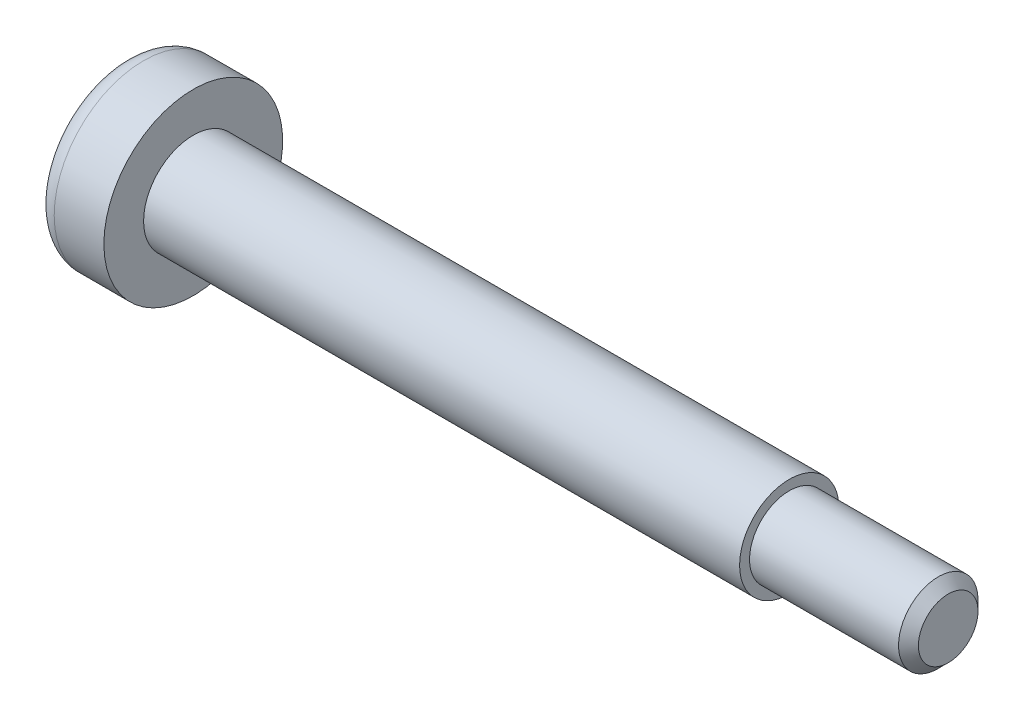
ISO-10303-21;
HEADER;
FILE_DESCRIPTION(('STEP AP214'),'2;1');
FILE_NAME('part.step','',(''),(''),'','','');
FILE_SCHEMA(('AUTOMOTIVE_DESIGN { 1 0 10303 214 1 1 1 1 }'));
ENDSEC;
DATA;
#1=APPLICATION_CONTEXT('core data for automotive mechanical design processes');
#2=APPLICATION_PROTOCOL_DEFINITION('international standard','automotive_design',2000,#1);
#3=PRODUCT_CONTEXT('',#1,'mechanical');
#4=PRODUCT('Part','Part','',(#3));
#5=PRODUCT_RELATED_PRODUCT_CATEGORY('part','',(#4));
#6=PRODUCT_DEFINITION_FORMATION('','',#4);
#7=PRODUCT_DEFINITION_CONTEXT('part definition',#1,'design');
#8=PRODUCT_DEFINITION('design','',#6,#7);
#9=PRODUCT_DEFINITION_SHAPE('','',#8);
#10=(LENGTH_UNIT() NAMED_UNIT(*) SI_UNIT(.MILLI.,.METRE.));
#11=(NAMED_UNIT(*) PLANE_ANGLE_UNIT() SI_UNIT($,.RADIAN.));
#12=(NAMED_UNIT(*) SI_UNIT($,.STERADIAN.) SOLID_ANGLE_UNIT());
#13=UNCERTAINTY_MEASURE_WITH_UNIT(LENGTH_MEASURE(1.E-05),#10,'distance_accuracy_value','');
#14=(GEOMETRIC_REPRESENTATION_CONTEXT(3) GLOBAL_UNCERTAINTY_ASSIGNED_CONTEXT((#13)) GLOBAL_UNIT_ASSIGNED_CONTEXT((#10,
#11,#12)) REPRESENTATION_CONTEXT('',''));
#15=CARTESIAN_POINT('',(0.,0.,0.));
#16=DIRECTION('',(0.,0.,1.));
#17=DIRECTION('',(1.,0.,0.));
#18=AXIS2_PLACEMENT_3D('',#15,#16,#17);
#19=CARTESIAN_POINT('',(0.,0.,0.));
#20=DIRECTION('',(1.,0.,0.));
#21=DIRECTION('',(0.,0.,-1.));
#22=AXIS2_PLACEMENT_3D('',#19,#20,#21);
#23=PLANE('',#22);
#24=CARTESIAN_POINT('',(0.,0.,0.));
#25=DIRECTION('',(1.,0.,0.));
#26=DIRECTION('',(0.,0.,-1.));
#27=AXIS2_PLACEMENT_3D('',#24,#25,#26);
#28=CIRCLE('',#27,3.5);
#29=CARTESIAN_POINT('',(0.,0.,-3.5));
#30=VERTEX_POINT('',#29);
#31=EDGE_CURVE('E156',#30,#30,#28,.F.);
#32=ORIENTED_EDGE('',*,*,#31,.T.);
#33=EDGE_LOOP('',(#32));
#34=FACE_BOUND('',#33,.T.);
#35=DIRECTION('',(0.,-0.5,-0.866025403784439));
#36=VECTOR('',#35,1.);
#37=CARTESIAN_POINT('',(0.,1.73205080756888,0.));
#38=LINE('',#37,#36);
#39=CARTESIAN_POINT('',(0.,1.73205080756888,0.));
#40=VERTEX_POINT('',#39);
#41=CARTESIAN_POINT('',(0.,0.866025403784439,-1.5));
#42=VERTEX_POINT('',#41);
#43=EDGE_CURVE('E126',#40,#42,#38,.T.);
#44=ORIENTED_EDGE('',*,*,#43,.F.);
#45=DIRECTION('',(0.,0.5,-0.866025403784439));
#46=VECTOR('',#45,1.);
#47=CARTESIAN_POINT('',(0.,0.86602540378444,1.5));
#48=LINE('',#47,#46);
#49=CARTESIAN_POINT('',(0.,0.86602540378444,1.5));
#50=VERTEX_POINT('',#49);
#51=EDGE_CURVE('E52',#50,#40,#48,.T.);
#52=ORIENTED_EDGE('',*,*,#51,.F.);
#53=DIRECTION('',(0.,1.,0.));
#54=VECTOR('',#53,1.);
#55=CARTESIAN_POINT('',(0.,-0.866025403784439,1.5));
#56=LINE('',#55,#54);
#57=CARTESIAN_POINT('',(0.,-0.866025403784439,1.5));
#58=VERTEX_POINT('',#57);
#59=EDGE_CURVE('E135',#58,#50,#56,.T.);
#60=ORIENTED_EDGE('',*,*,#59,.F.);
#61=DIRECTION('',(0.,0.5,0.866025403784439));
#62=VECTOR('',#61,1.);
#63=CARTESIAN_POINT('',(0.,-1.73205080756888,0.));
#64=LINE('',#63,#62);
#65=CARTESIAN_POINT('',(0.,-1.73205080756888,0.));
#66=VERTEX_POINT('',#65);
#67=EDGE_CURVE('E133',#66,#58,#64,.T.);
#68=ORIENTED_EDGE('',*,*,#67,.F.);
#69=DIRECTION('',(0.,-0.5,0.866025403784439));
#70=VECTOR('',#69,1.);
#71=CARTESIAN_POINT('',(0.,-0.866025403784439,-1.5));
#72=LINE('',#71,#70);
#73=CARTESIAN_POINT('',(0.,-0.866025403784439,-1.5));
#74=VERTEX_POINT('',#73);
#75=EDGE_CURVE('E100',#74,#66,#72,.T.);
#76=ORIENTED_EDGE('',*,*,#75,.F.);
#77=DIRECTION('',(0.,-1.,0.));
#78=VECTOR('',#77,1.);
#79=CARTESIAN_POINT('',(0.,0.866025403784439,-1.5));
#80=LINE('',#79,#78);
#81=EDGE_CURVE('E129',#42,#74,#80,.T.);
#82=ORIENTED_EDGE('',*,*,#81,.F.);
#83=EDGE_LOOP('',(#44,#52,#60,#68,#76,#82));
#84=FACE_BOUND('',#83,.T.);
#85=ADVANCED_FACE('F37',(#34,#84),#23,.F.);
#86=CARTESIAN_POINT('',(0.,0.,0.));
#87=DIRECTION('',(-1.,0.,0.));
#88=DIRECTION('',(0.,0.,1.));
#89=AXIS2_PLACEMENT_3D('',#86,#87,#88);
#90=CYLINDRICAL_SURFACE('',#89,4.5);
#91=CARTESIAN_POINT('',(1.,0.,0.));
#92=DIRECTION('',(1.,0.,0.));
#93=DIRECTION('',(0.,0.,-1.));
#94=AXIS2_PLACEMENT_3D('',#91,#92,#93);
#95=CIRCLE('',#94,4.5);
#96=CARTESIAN_POINT('',(1.,0.,-4.5));
#97=VERTEX_POINT('',#96);
#98=EDGE_CURVE('E159',#97,#97,#95,.T.);
#99=ORIENTED_EDGE('',*,*,#98,.T.);
#100=EDGE_LOOP('',(#99));
#101=FACE_BOUND('',#100,.T.);
#102=CARTESIAN_POINT('',(3.5,0.,0.));
#103=DIRECTION('',(-1.,0.,0.));
#104=DIRECTION('',(0.,0.,1.));
#105=AXIS2_PLACEMENT_3D('',#102,#103,#104);
#106=CIRCLE('',#105,4.5);
#107=CARTESIAN_POINT('',(3.5,0.,4.5));
#108=VERTEX_POINT('',#107);
#109=EDGE_CURVE('E153',#108,#108,#106,.T.);
#110=ORIENTED_EDGE('',*,*,#109,.T.);
#111=EDGE_LOOP('',(#110));
#112=FACE_BOUND('',#111,.T.);
#113=ADVANCED_FACE('F176',(#101,#112),#90,.T.);
#114=CARTESIAN_POINT('',(3.5,4.5,0.));
#115=DIRECTION('',(-1.,0.,0.));
#116=DIRECTION('',(0.,0.,1.));
#117=AXIS2_PLACEMENT_3D('',#114,#115,#116);
#118=PLANE('',#117);
#119=ORIENTED_EDGE('',*,*,#109,.F.);
#120=EDGE_LOOP('',(#119));
#121=FACE_BOUND('',#120,.T.);
#122=CARTESIAN_POINT('',(3.5,0.,0.));
#123=DIRECTION('',(-1.,0.,0.));
#124=DIRECTION('',(0.,0.,1.));
#125=AXIS2_PLACEMENT_3D('',#122,#123,#124);
#126=CIRCLE('',#125,2.5);
#127=CARTESIAN_POINT('',(3.5,0.,2.5));
#128=VERTEX_POINT('',#127);
#129=EDGE_CURVE('E150',#128,#128,#126,.T.);
#130=ORIENTED_EDGE('',*,*,#129,.T.);
#131=EDGE_LOOP('',(#130));
#132=FACE_BOUND('',#131,.T.);
#133=ADVANCED_FACE('F182',(#121,#132),#118,.F.);
#134=CARTESIAN_POINT('',(0.,0.,0.));
#135=DIRECTION('',(-1.,0.,0.));
#136=DIRECTION('',(0.,0.,1.));
#137=AXIS2_PLACEMENT_3D('',#134,#135,#136);
#138=CYLINDRICAL_SURFACE('',#137,2.5);
#139=ORIENTED_EDGE('',*,*,#129,.F.);
#140=EDGE_LOOP('',(#139));
#141=FACE_BOUND('',#140,.T.);
#142=CARTESIAN_POINT('',(33.5,0.,0.));
#143=DIRECTION('',(-1.,0.,0.));
#144=DIRECTION('',(0.,0.,1.));
#145=AXIS2_PLACEMENT_3D('',#142,#143,#144);
#146=CIRCLE('',#145,2.5);
#147=CARTESIAN_POINT('',(33.5,0.,2.5));
#148=VERTEX_POINT('',#147);
#149=EDGE_CURVE('E147',#148,#148,#146,.T.);
#150=ORIENTED_EDGE('',*,*,#149,.T.);
#151=EDGE_LOOP('',(#150));
#152=FACE_BOUND('',#151,.T.);
#153=ADVANCED_FACE('F189',(#141,#152),#138,.T.);
#154=CARTESIAN_POINT('',(33.5,2.5,0.));
#155=DIRECTION('',(-1.,0.,0.));
#156=DIRECTION('',(0.,0.,1.));
#157=AXIS2_PLACEMENT_3D('',#154,#155,#156);
#158=PLANE('',#157);
#159=ORIENTED_EDGE('',*,*,#149,.F.);
#160=EDGE_LOOP('',(#159));
#161=FACE_BOUND('',#160,.T.);
#162=CARTESIAN_POINT('',(33.5,0.,0.));
#163=DIRECTION('',(-1.,0.,0.));
#164=DIRECTION('',(0.,0.,1.));
#165=AXIS2_PLACEMENT_3D('',#162,#163,#164);
#166=CIRCLE('',#165,2.);
#167=CARTESIAN_POINT('',(33.5,0.,2.));
#168=VERTEX_POINT('',#167);
#169=EDGE_CURVE('E139',#168,#168,#166,.T.);
#170=ORIENTED_EDGE('',*,*,#169,.T.);
#171=EDGE_LOOP('',(#170));
#172=FACE_BOUND('',#171,.T.);
#173=ADVANCED_FACE('F193',(#161,#172),#158,.F.);
#174=CARTESIAN_POINT('',(0.,0.,0.));
#175=DIRECTION('',(-1.,0.,0.));
#176=DIRECTION('',(0.,0.,1.));
#177=AXIS2_PLACEMENT_3D('',#174,#175,#176);
#178=CYLINDRICAL_SURFACE('',#177,2.);
#179=CARTESIAN_POINT('',(41.,0.,0.));
#180=DIRECTION('',(-1.,0.,0.));
#181=DIRECTION('',(0.,0.,1.));
#182=AXIS2_PLACEMENT_3D('',#179,#180,#181);
#183=CIRCLE('',#182,2.);
#184=CARTESIAN_POINT('',(41.,0.,2.));
#185=VERTEX_POINT('',#184);
#186=EDGE_CURVE('E45',#185,#185,#183,.T.);
#187=ORIENTED_EDGE('',*,*,#186,.T.);
#188=EDGE_LOOP('',(#187));
#189=FACE_BOUND('',#188,.T.);
#190=ORIENTED_EDGE('',*,*,#169,.F.);
#191=EDGE_LOOP('',(#190));
#192=FACE_BOUND('',#191,.T.);
#193=ADVANCED_FACE('F164',(#189,#192),#178,.T.);
#194=CARTESIAN_POINT('',(41.5,2.,0.));
#195=DIRECTION('',(-1.,0.,0.));
#196=DIRECTION('',(0.,0.,1.));
#197=AXIS2_PLACEMENT_3D('',#194,#195,#196);
#198=PLANE('',#197);
#199=CARTESIAN_POINT('',(41.5,0.,0.));
#200=DIRECTION('',(-1.,0.,0.));
#201=DIRECTION('',(0.,0.,1.));
#202=AXIS2_PLACEMENT_3D('',#199,#200,#201);
#203=CIRCLE('',#202,1.49999999999999);
#204=CARTESIAN_POINT('',(41.5,0.,1.49999999999999));
#205=VERTEX_POINT('',#204);
#206=EDGE_CURVE('E11',#205,#205,#203,.F.);
#207=ORIENTED_EDGE('',*,*,#206,.T.);
#208=EDGE_LOOP('',(#207));
#209=FACE_BOUND('',#208,.T.);
#210=ADVANCED_FACE('F200',(#209),#198,.F.);
#211=CARTESIAN_POINT('',(2.4,0.86602540378444,1.5));
#212=DIRECTION('',(0.,0.866025403784439,0.5));
#213=DIRECTION('',(0.,-0.5,0.866025403784439));
#214=AXIS2_PLACEMENT_3D('',#211,#212,#213);
#215=PLANE('',#214);
#216=ORIENTED_EDGE('',*,*,#51,.T.);
#217=DIRECTION('',(-1.,0.,0.));
#218=VECTOR('',#217,1.);
#219=CARTESIAN_POINT('',(2.4,1.73205080756888,0.));
#220=LINE('',#219,#218);
#221=CARTESIAN_POINT('',(2.4,1.73205080756888,0.));
#222=VERTEX_POINT('',#221);
#223=EDGE_CURVE('E82',#222,#40,#220,.T.);
#224=ORIENTED_EDGE('',*,*,#223,.F.);
#225=DIRECTION('',(0.,0.5,-0.866025403784439));
#226=VECTOR('',#225,1.);
#227=CARTESIAN_POINT('',(2.4,0.86602540378444,1.5));
#228=LINE('',#227,#226);
#229=CARTESIAN_POINT('',(2.4,0.86602540378444,1.5));
#230=VERTEX_POINT('',#229);
#231=EDGE_CURVE('E137',#230,#222,#228,.T.);
#232=ORIENTED_EDGE('',*,*,#231,.F.);
#233=DIRECTION('',(-1.,0.,0.));
#234=VECTOR('',#233,1.);
#235=CARTESIAN_POINT('',(2.4,0.86602540378444,1.5));
#236=LINE('',#235,#234);
#237=EDGE_CURVE('E60',#230,#50,#236,.T.);
#238=ORIENTED_EDGE('',*,*,#237,.T.);
#239=EDGE_LOOP('',(#216,#224,#232,#238));
#240=FACE_BOUND('',#239,.T.);
#241=ADVANCED_FACE('F203',(#240),#215,.F.);
#242=CARTESIAN_POINT('',(2.4,-0.866025403784439,1.5));
#243=DIRECTION('',(0.,0.,1.));
#244=DIRECTION('',(1.,0.,0.));
#245=AXIS2_PLACEMENT_3D('',#242,#243,#244);
#246=PLANE('',#245);
#247=ORIENTED_EDGE('',*,*,#59,.T.);
#248=ORIENTED_EDGE('',*,*,#237,.F.);
#249=DIRECTION('',(0.,1.,0.));
#250=VECTOR('',#249,1.);
#251=CARTESIAN_POINT('',(2.4,-0.866025403784439,1.5));
#252=LINE('',#251,#250);
#253=CARTESIAN_POINT('',(2.4,-0.866025403784439,1.5));
#254=VERTEX_POINT('',#253);
#255=EDGE_CURVE('E112',#254,#230,#252,.T.);
#256=ORIENTED_EDGE('',*,*,#255,.F.);
#257=DIRECTION('',(-1.,0.,0.));
#258=VECTOR('',#257,1.);
#259=CARTESIAN_POINT('',(2.4,-0.866025403784439,1.5));
#260=LINE('',#259,#258);
#261=EDGE_CURVE('E104',#254,#58,#260,.T.);
#262=ORIENTED_EDGE('',*,*,#261,.T.);
#263=EDGE_LOOP('',(#247,#248,#256,#262));
#264=FACE_BOUND('',#263,.T.);
#265=ADVANCED_FACE('F207',(#264),#246,.F.);
#266=CARTESIAN_POINT('',(2.4,-1.73205080756888,0.));
#267=DIRECTION('',(0.,-0.866025403784439,0.5));
#268=DIRECTION('',(0.,-0.5,-0.866025403784439));
#269=AXIS2_PLACEMENT_3D('',#266,#267,#268);
#270=PLANE('',#269);
#271=ORIENTED_EDGE('',*,*,#67,.T.);
#272=ORIENTED_EDGE('',*,*,#261,.F.);
#273=DIRECTION('',(0.,0.5,0.866025403784439));
#274=VECTOR('',#273,1.);
#275=CARTESIAN_POINT('',(2.4,-1.73205080756888,0.));
#276=LINE('',#275,#274);
#277=CARTESIAN_POINT('',(2.4,-1.73205080756888,0.));
#278=VERTEX_POINT('',#277);
#279=EDGE_CURVE('E108',#278,#254,#276,.T.);
#280=ORIENTED_EDGE('',*,*,#279,.F.);
#281=DIRECTION('',(-1.,0.,0.));
#282=VECTOR('',#281,1.);
#283=CARTESIAN_POINT('',(2.4,-1.73205080756888,0.));
#284=LINE('',#283,#282);
#285=EDGE_CURVE('E93',#278,#66,#284,.T.);
#286=ORIENTED_EDGE('',*,*,#285,.T.);
#287=EDGE_LOOP('',(#271,#272,#280,#286));
#288=FACE_BOUND('',#287,.T.);
#289=ADVANCED_FACE('F109',(#288),#270,.F.);
#290=CARTESIAN_POINT('',(2.4,-0.866025403784439,-1.5));
#291=DIRECTION('',(0.,-0.866025403784439,-0.5));
#292=DIRECTION('',(0.,0.5,-0.866025403784439));
#293=AXIS2_PLACEMENT_3D('',#290,#291,#292);
#294=PLANE('',#293);
#295=ORIENTED_EDGE('',*,*,#75,.T.);
#296=ORIENTED_EDGE('',*,*,#285,.F.);
#297=DIRECTION('',(0.,-0.5,0.866025403784439));
#298=VECTOR('',#297,1.);
#299=CARTESIAN_POINT('',(2.4,-0.866025403784439,-1.5));
#300=LINE('',#299,#298);
#301=CARTESIAN_POINT('',(2.4,-0.866025403784439,-1.5));
#302=VERTEX_POINT('',#301);
#303=EDGE_CURVE('E97',#302,#278,#300,.T.);
#304=ORIENTED_EDGE('',*,*,#303,.F.);
#305=DIRECTION('',(-1.,0.,0.));
#306=VECTOR('',#305,1.);
#307=CARTESIAN_POINT('',(2.4,-0.866025403784439,-1.5));
#308=LINE('',#307,#306);
#309=EDGE_CURVE('E105',#302,#74,#308,.T.);
#310=ORIENTED_EDGE('',*,*,#309,.T.);
#311=EDGE_LOOP('',(#295,#296,#304,#310));
#312=FACE_BOUND('',#311,.T.);
#313=ADVANCED_FACE('F95',(#312),#294,.F.);
#314=CARTESIAN_POINT('',(2.4,0.866025403784439,-1.5));
#315=DIRECTION('',(0.,0.,-1.));
#316=DIRECTION('',(-1.,0.,0.));
#317=AXIS2_PLACEMENT_3D('',#314,#315,#316);
#318=PLANE('',#317);
#319=ORIENTED_EDGE('',*,*,#81,.T.);
#320=ORIENTED_EDGE('',*,*,#309,.F.);
#321=DIRECTION('',(0.,-1.,0.));
#322=VECTOR('',#321,1.);
#323=CARTESIAN_POINT('',(2.4,0.866025403784439,-1.5));
#324=LINE('',#323,#322);
#325=CARTESIAN_POINT('',(2.4,0.866025403784439,-1.5));
#326=VERTEX_POINT('',#325);
#327=EDGE_CURVE('E118',#326,#302,#324,.T.);
#328=ORIENTED_EDGE('',*,*,#327,.F.);
#329=DIRECTION('',(-1.,0.,0.));
#330=VECTOR('',#329,1.);
#331=CARTESIAN_POINT('',(2.4,0.866025403784439,-1.5));
#332=LINE('',#331,#330);
#333=EDGE_CURVE('E142',#326,#42,#332,.T.);
#334=ORIENTED_EDGE('',*,*,#333,.T.);
#335=EDGE_LOOP('',(#319,#320,#328,#334));
#336=FACE_BOUND('',#335,.T.);
#337=ADVANCED_FACE('F211',(#336),#318,.F.);
#338=CARTESIAN_POINT('',(2.4,1.73205080756888,0.));
#339=DIRECTION('',(0.,0.866025403784439,-0.5));
#340=DIRECTION('',(0.,0.5,0.866025403784439));
#341=AXIS2_PLACEMENT_3D('',#338,#339,#340);
#342=PLANE('',#341);
#343=ORIENTED_EDGE('',*,*,#43,.T.);
#344=ORIENTED_EDGE('',*,*,#333,.F.);
#345=DIRECTION('',(0.,-0.5,-0.866025403784439));
#346=VECTOR('',#345,1.);
#347=CARTESIAN_POINT('',(2.4,1.73205080756888,0.));
#348=LINE('',#347,#346);
#349=EDGE_CURVE('E120',#222,#326,#348,.T.);
#350=ORIENTED_EDGE('',*,*,#349,.F.);
#351=ORIENTED_EDGE('',*,*,#223,.T.);
#352=EDGE_LOOP('',(#343,#344,#350,#351));
#353=FACE_BOUND('',#352,.T.);
#354=ADVANCED_FACE('F208',(#353),#342,.F.);
#355=CARTESIAN_POINT('',(2.4,0.,0.));
#356=DIRECTION('',(-1.,0.,0.));
#357=DIRECTION('',(0.,0.,1.));
#358=AXIS2_PLACEMENT_3D('',#355,#356,#357);
#359=PLANE('',#358);
#360=ORIENTED_EDGE('',*,*,#231,.T.);
#361=ORIENTED_EDGE('',*,*,#349,.T.);
#362=ORIENTED_EDGE('',*,*,#327,.T.);
#363=ORIENTED_EDGE('',*,*,#303,.T.);
#364=ORIENTED_EDGE('',*,*,#279,.T.);
#365=ORIENTED_EDGE('',*,*,#255,.T.);
#366=EDGE_LOOP('',(#360,#361,#362,#363,#364,#365));
#367=FACE_BOUND('',#366,.T.);
#368=ADVANCED_FACE('F115',(#367),#359,.T.);
#369=CARTESIAN_POINT('',(1.,0.,0.));
#370=DIRECTION('',(1.,0.,0.));
#371=DIRECTION('',(0.,0.,-1.));
#372=AXIS2_PLACEMENT_3D('',#369,#370,#371);
#373=TOROIDAL_SURFACE('',#372,3.5,1.);
#374=ORIENTED_EDGE('',*,*,#98,.F.);
#375=EDGE_LOOP('',(#374));
#376=FACE_BOUND('',#375,.T.);
#377=ORIENTED_EDGE('',*,*,#31,.F.);
#378=EDGE_LOOP('',(#377));
#379=FACE_BOUND('',#378,.T.);
#380=ADVANCED_FACE('F168',(#376,#379),#373,.T.);
#381=CARTESIAN_POINT('',(41.,0.,0.));
#382=DIRECTION('',(-1.,0.,0.));
#383=DIRECTION('',(0.,0.,1.));
#384=AXIS2_PLACEMENT_3D('',#381,#382,#383);
#385=CONICAL_SURFACE('',#384,2.,0.785398163397443);
#386=ORIENTED_EDGE('',*,*,#206,.F.);
#387=EDGE_LOOP('',(#386));
#388=FACE_BOUND('',#387,.T.);
#389=ORIENTED_EDGE('',*,*,#186,.F.);
#390=EDGE_LOOP('',(#389));
#391=FACE_BOUND('',#390,.T.);
#392=ADVANCED_FACE('F39',(#388,#391),#385,.T.);
#393=CLOSED_SHELL('',(#85,#113,#133,#153,#173,#193,#210,#241,#265,#289,#313,#337,#354,#368,#380,#392));
#394=MANIFOLD_SOLID_BREP('B2',#393);
#395=ADVANCED_BREP_SHAPE_REPRESENTATION('',(#18,#394),#14);
#396=SHAPE_DEFINITION_REPRESENTATION(#9,#395);
ENDSEC;
END-ISO-10303-21;
